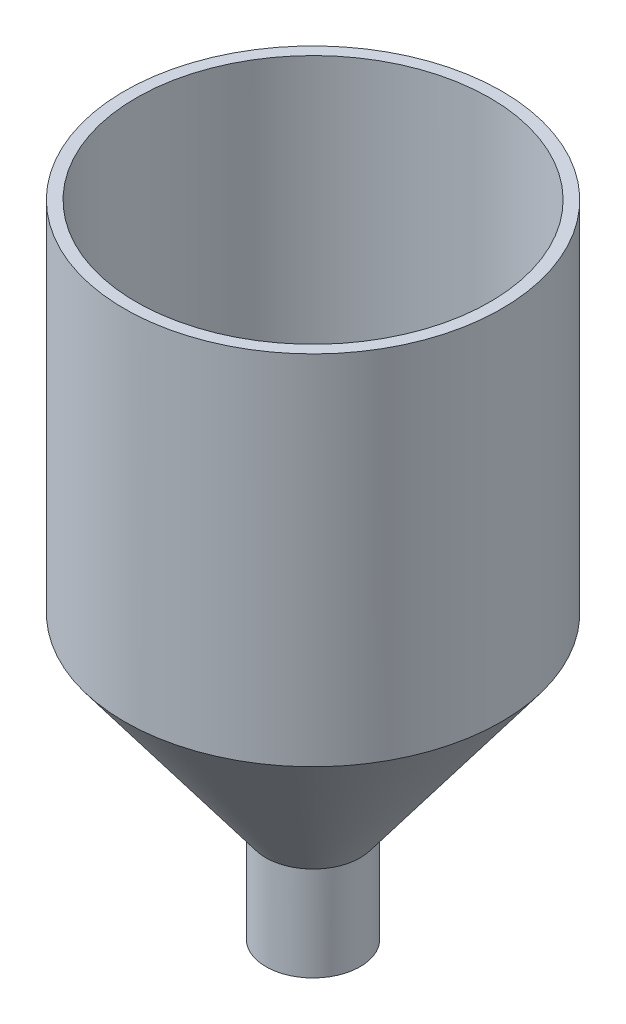
ISO-10303-21;
HEADER;
FILE_DESCRIPTION(('STEP AP214'),'2;1');
FILE_NAME('part.step','',(''),(''),'','','');
FILE_SCHEMA(('AUTOMOTIVE_DESIGN { 1 0 10303 214 1 1 1 1 }'));
ENDSEC;
DATA;
#1=APPLICATION_CONTEXT('core data for automotive mechanical design processes');
#2=APPLICATION_PROTOCOL_DEFINITION('international standard','automotive_design',2000,#1);
#3=PRODUCT_CONTEXT('',#1,'mechanical');
#4=PRODUCT('Part','Part','',(#3));
#5=PRODUCT_RELATED_PRODUCT_CATEGORY('part','',(#4));
#6=PRODUCT_DEFINITION_FORMATION('','',#4);
#7=PRODUCT_DEFINITION_CONTEXT('part definition',#1,'design');
#8=PRODUCT_DEFINITION('design','',#6,#7);
#9=PRODUCT_DEFINITION_SHAPE('','',#8);
#10=(LENGTH_UNIT() NAMED_UNIT(*) SI_UNIT(.MILLI.,.METRE.));
#11=(NAMED_UNIT(*) PLANE_ANGLE_UNIT() SI_UNIT($,.RADIAN.));
#12=(NAMED_UNIT(*) SI_UNIT($,.STERADIAN.) SOLID_ANGLE_UNIT());
#13=UNCERTAINTY_MEASURE_WITH_UNIT(LENGTH_MEASURE(1.E-05),#10,'distance_accuracy_value','');
#14=(GEOMETRIC_REPRESENTATION_CONTEXT(3) GLOBAL_UNCERTAINTY_ASSIGNED_CONTEXT((#13)) GLOBAL_UNIT_ASSIGNED_CONTEXT((#10,
#11,#12)) REPRESENTATION_CONTEXT('',''));
#15=CARTESIAN_POINT('',(0.,0.,0.));
#16=DIRECTION('',(0.,0.,1.));
#17=DIRECTION('',(1.,0.,0.));
#18=AXIS2_PLACEMENT_3D('',#15,#16,#17);
#19=CARTESIAN_POINT('',(-4.,0.,0.));
#20=DIRECTION('',(0.,1.,0.));
#21=DIRECTION('',(0.,0.,1.));
#22=AXIS2_PLACEMENT_3D('',#19,#20,#21);
#23=PLANE('',#22);
#24=CARTESIAN_POINT('',(0.,0.,0.));
#25=DIRECTION('',(0.,-1.,0.));
#26=DIRECTION('',(0.,0.,-1.));
#27=AXIS2_PLACEMENT_3D('',#24,#25,#26);
#28=CIRCLE('',#27,3.);
#29=CARTESIAN_POINT('',(0.,0.,-3.));
#30=VERTEX_POINT('',#29);
#31=EDGE_CURVE('E10',#30,#30,#28,.T.);
#32=ORIENTED_EDGE('',*,*,#31,.F.);
#33=EDGE_LOOP('',(#32));
#34=FACE_BOUND('',#33,.T.);
#35=CARTESIAN_POINT('',(0.,0.,0.));
#36=DIRECTION('',(0.,-1.,0.));
#37=DIRECTION('',(0.,0.,-1.));
#38=AXIS2_PLACEMENT_3D('',#35,#36,#37);
#39=CIRCLE('',#38,4.);
#40=CARTESIAN_POINT('',(0.,0.,-4.));
#41=VERTEX_POINT('',#40);
#42=EDGE_CURVE('E72',#41,#41,#39,.T.);
#43=ORIENTED_EDGE('',*,*,#42,.T.);
#44=EDGE_LOOP('',(#43));
#45=FACE_BOUND('',#44,.T.);
#46=ADVANCED_FACE('F37',(#34,#45),#23,.F.);
#47=CARTESIAN_POINT('',(0.,0.,0.));
#48=DIRECTION('',(0.,-1.,0.));
#49=DIRECTION('',(0.,0.,-1.));
#50=AXIS2_PLACEMENT_3D('',#47,#48,#49);
#51=CYLINDRICAL_SURFACE('',#50,3.);
#52=CARTESIAN_POINT('',(0.,8.33333333333334,0.));
#53=DIRECTION('',(0.,-1.,0.));
#54=DIRECTION('',(0.,0.,-1.));
#55=AXIS2_PLACEMENT_3D('',#52,#53,#54);
#56=CIRCLE('',#55,3.);
#57=CARTESIAN_POINT('',(0.,8.33333333333334,3.));
#58=VERTEX_POINT('',#57);
#59=EDGE_CURVE('E44',#58,#58,#56,.T.);
#60=ORIENTED_EDGE('',*,*,#59,.F.);
#61=EDGE_LOOP('',(#60));
#62=FACE_BOUND('',#61,.T.);
#63=ORIENTED_EDGE('',*,*,#31,.T.);
#64=EDGE_LOOP('',(#63));
#65=FACE_BOUND('',#64,.T.);
#66=ADVANCED_FACE('F110',(#62,#65),#51,.F.);
#67=CARTESIAN_POINT('',(0.,8.33333333333334,0.));
#68=DIRECTION('',(0.,1.,0.));
#69=DIRECTION('',(0.,0.,1.));
#70=AXIS2_PLACEMENT_3D('',#67,#68,#69);
#71=CONICAL_SURFACE('',#70,3.,0.643501108793284);
#72=CARTESIAN_POINT('',(0.,24.3333333333333,0.));
#73=DIRECTION('',(0.,-1.,0.));
#74=DIRECTION('',(0.,0.,-1.));
#75=AXIS2_PLACEMENT_3D('',#72,#73,#74);
#76=CIRCLE('',#75,15.);
#77=CARTESIAN_POINT('',(0.,24.3333333333333,15.));
#78=VERTEX_POINT('',#77);
#79=EDGE_CURVE('E49',#78,#78,#76,.T.);
#80=CARTESIAN_POINT('',(0.,24.3333333333333,15.));
#81=CARTESIAN_POINT('',(0.,24.1666666666667,14.875));
#82=CARTESIAN_POINT('',(0.,24.,14.75));
#83=CARTESIAN_POINT('',(0.,23.6666666666667,14.5));
#84=CARTESIAN_POINT('',(0.,23.5,14.375));
#85=CARTESIAN_POINT('',(0.,23.1666666666667,14.125));
#86=CARTESIAN_POINT('',(0.,23.,14.));
#87=CARTESIAN_POINT('',(0.,22.6666666666667,13.75));
#88=CARTESIAN_POINT('',(0.,22.5,13.625));
#89=CARTESIAN_POINT('',(0.,22.1666666666667,13.375));
#90=CARTESIAN_POINT('',(0.,22.,13.25));
#91=CARTESIAN_POINT('',(0.,21.6666666666667,13.));
#92=CARTESIAN_POINT('',(0.,21.5,12.875));
#93=CARTESIAN_POINT('',(0.,21.1666666666667,12.625));
#94=CARTESIAN_POINT('',(0.,21.,12.5));
#95=CARTESIAN_POINT('',(0.,20.6666666666667,12.25));
#96=CARTESIAN_POINT('',(0.,20.5,12.125));
#97=CARTESIAN_POINT('',(0.,20.1666666666667,11.875));
#98=CARTESIAN_POINT('',(0.,20.,11.75));
#99=CARTESIAN_POINT('',(0.,19.6666666666667,11.5));
#100=CARTESIAN_POINT('',(0.,19.5,11.375));
#101=CARTESIAN_POINT('',(0.,19.1666666666667,11.125));
#102=CARTESIAN_POINT('',(0.,19.,11.));
#103=CARTESIAN_POINT('',(0.,18.6666666666667,10.75));
#104=CARTESIAN_POINT('',(0.,18.5,10.625));
#105=CARTESIAN_POINT('',(0.,18.1666666666667,10.375));
#106=CARTESIAN_POINT('',(0.,18.,10.25));
#107=CARTESIAN_POINT('',(0.,17.6666666666667,10.));
#108=CARTESIAN_POINT('',(0.,17.5,9.87500000000001));
#109=CARTESIAN_POINT('',(0.,17.1666666666667,9.62500000000001));
#110=CARTESIAN_POINT('',(0.,17.,9.50000000000001));
#111=CARTESIAN_POINT('',(0.,16.6666666666667,9.25000000000001));
#112=CARTESIAN_POINT('',(0.,16.5,9.12500000000001));
#113=CARTESIAN_POINT('',(0.,16.1666666666667,8.875));
#114=CARTESIAN_POINT('',(0.,16.,8.75));
#115=CARTESIAN_POINT('',(0.,15.6666666666667,8.5));
#116=CARTESIAN_POINT('',(0.,15.5,8.375));
#117=CARTESIAN_POINT('',(0.,15.1666666666667,8.125));
#118=CARTESIAN_POINT('',(0.,15.,8.));
#119=CARTESIAN_POINT('',(0.,14.6666666666667,7.75));
#120=CARTESIAN_POINT('',(0.,14.5,7.625));
#121=CARTESIAN_POINT('',(0.,14.1666666666667,7.375));
#122=CARTESIAN_POINT('',(0.,14.,7.25));
#123=CARTESIAN_POINT('',(0.,13.6666666666667,7.));
#124=CARTESIAN_POINT('',(0.,13.5,6.875));
#125=CARTESIAN_POINT('',(0.,13.1666666666667,6.625));
#126=CARTESIAN_POINT('',(0.,13.,6.5));
#127=CARTESIAN_POINT('',(0.,12.6666666666667,6.25));
#128=CARTESIAN_POINT('',(0.,12.5,6.125));
#129=CARTESIAN_POINT('',(0.,12.1666666666667,5.875));
#130=CARTESIAN_POINT('',(0.,12.,5.75));
#131=CARTESIAN_POINT('',(0.,11.6666666666667,5.5));
#132=CARTESIAN_POINT('',(0.,11.5,5.375));
#133=CARTESIAN_POINT('',(0.,11.1666666666667,5.125));
#134=CARTESIAN_POINT('',(0.,11.,5.));
#135=CARTESIAN_POINT('',(0.,10.6666666666667,4.75));
#136=CARTESIAN_POINT('',(0.,10.5,4.625));
#137=CARTESIAN_POINT('',(0.,10.1666666666667,4.375));
#138=CARTESIAN_POINT('',(0.,10.,4.25));
#139=CARTESIAN_POINT('',(0.,9.66666666666667,4.));
#140=CARTESIAN_POINT('',(0.,9.5,3.875));
#141=CARTESIAN_POINT('',(0.,9.16666666666667,3.625));
#142=CARTESIAN_POINT('',(0.,9.,3.5));
#143=CARTESIAN_POINT('',(0.,8.66666666666667,3.25));
#144=CARTESIAN_POINT('',(0.,8.5,3.125));
#145=CARTESIAN_POINT('',(0.,8.33333333333334,3.));
#146=B_SPLINE_CURVE_WITH_KNOTS('',3,(#80,#81,#82,#83,#84,#85,#86,#87,#88,#89,#90,#91,#92,#93,
#94,#95,#96,#97,#98,#99,#100,#101,#102,#103,#104,#105,#106,#107,#108,#109,#110,#111,#112,#113,
#114,#115,#116,#117,#118,#119,#120,#121,#122,#123,#124,#125,#126,#127,#128,#129,#130,#131,#132,
#133,#134,#135,#136,#137,#138,#139,#140,#141,#142,#143,#144,#145),.UNSPECIFIED.,.F.,.F.,(4,2,2,
2,2,2,2,2,2,2,2,2,2,2,2,2,2,2,2,2,2,2,2,2,2,2,2,2,2,2,2,2,4),(0.,0.625000000000001,1.25,1.875,
2.5,3.125,3.75,4.375,5.,5.625,6.25,6.875,7.5,8.125,8.75,9.375,10.,10.625,11.25,11.875,12.5,
13.125,13.75,14.375,15.,15.625,16.25,16.875,17.5,18.125,18.75,19.375,20.),.UNSPECIFIED.);
#147=EDGE_CURVE('BSEAM105',#78,#58,#146,.T.);
#148=ORIENTED_EDGE('',*,*,#79,.F.);
#149=ORIENTED_EDGE('',*,*,#59,.T.);
#150=ORIENTED_EDGE('',*,*,#147,.T.);
#151=ORIENTED_EDGE('',*,*,#147,.F.);
#152=EDGE_LOOP('',(#148,#150,#149,#151));
#153=FACE_BOUND('',#152,.T.);
#154=ADVANCED_FACE('F105',(#153),#71,.F.);
#155=CARTESIAN_POINT('',(0.,0.,0.));
#156=DIRECTION('',(0.,-1.,0.));
#157=DIRECTION('',(0.,0.,-1.));
#158=AXIS2_PLACEMENT_3D('',#155,#156,#157);
#159=CYLINDRICAL_SURFACE('',#158,15.);
#160=CARTESIAN_POINT('',(0.,54.3333333333333,0.));
#161=DIRECTION('',(0.,-1.,0.));
#162=DIRECTION('',(0.,0.,-1.));
#163=AXIS2_PLACEMENT_3D('',#160,#161,#162);
#164=CIRCLE('',#163,15.);
#165=CARTESIAN_POINT('',(0.,54.3333333333333,-15.));
#166=VERTEX_POINT('',#165);
#167=EDGE_CURVE('E54',#166,#166,#164,.T.);
#168=ORIENTED_EDGE('',*,*,#167,.F.);
#169=EDGE_LOOP('',(#168));
#170=FACE_BOUND('',#169,.T.);
#171=ORIENTED_EDGE('',*,*,#79,.T.);
#172=EDGE_LOOP('',(#171));
#173=FACE_BOUND('',#172,.T.);
#174=ADVANCED_FACE('F99',(#170,#173),#159,.F.);
#175=CARTESIAN_POINT('',(-15.,54.3333333333333,0.));
#176=DIRECTION('',(0.,-1.,0.));
#177=DIRECTION('',(0.,0.,-1.));
#178=AXIS2_PLACEMENT_3D('',#175,#176,#177);
#179=PLANE('',#178);
#180=CARTESIAN_POINT('',(0.,54.3333333333333,0.));
#181=DIRECTION('',(0.,-1.,0.));
#182=DIRECTION('',(0.,0.,-1.));
#183=AXIS2_PLACEMENT_3D('',#180,#181,#182);
#184=CIRCLE('',#183,16.);
#185=CARTESIAN_POINT('',(0.,54.3333333333333,-16.));
#186=VERTEX_POINT('',#185);
#187=EDGE_CURVE('E60',#186,#186,#184,.T.);
#188=ORIENTED_EDGE('',*,*,#187,.F.);
#189=EDGE_LOOP('',(#188));
#190=FACE_BOUND('',#189,.T.);
#191=ORIENTED_EDGE('',*,*,#167,.T.);
#192=EDGE_LOOP('',(#191));
#193=FACE_BOUND('',#192,.T.);
#194=ADVANCED_FACE('F93',(#190,#193),#179,.F.);
#195=CARTESIAN_POINT('',(0.,0.,0.));
#196=DIRECTION('',(0.,-1.,0.));
#197=DIRECTION('',(0.,0.,-1.));
#198=AXIS2_PLACEMENT_3D('',#195,#196,#197);
#199=CYLINDRICAL_SURFACE('',#198,16.);
#200=CARTESIAN_POINT('',(0.,24.,0.));
#201=DIRECTION('',(0.,-1.,0.));
#202=DIRECTION('',(0.,0.,-1.));
#203=AXIS2_PLACEMENT_3D('',#200,#201,#202);
#204=CIRCLE('',#203,16.);
#205=CARTESIAN_POINT('',(0.,24.,16.));
#206=VERTEX_POINT('',#205);
#207=EDGE_CURVE('E64',#206,#206,#204,.T.);
#208=ORIENTED_EDGE('',*,*,#207,.F.);
#209=EDGE_LOOP('',(#208));
#210=FACE_BOUND('',#209,.T.);
#211=ORIENTED_EDGE('',*,*,#187,.T.);
#212=EDGE_LOOP('',(#211));
#213=FACE_BOUND('',#212,.T.);
#214=ADVANCED_FACE('F87',(#210,#213),#199,.T.);
#215=CARTESIAN_POINT('',(0.,24.,0.));
#216=DIRECTION('',(0.,1.,0.));
#217=DIRECTION('',(0.,0.,1.));
#218=AXIS2_PLACEMENT_3D('',#215,#216,#217);
#219=CONICAL_SURFACE('',#218,16.,0.643501108793284);
#220=CARTESIAN_POINT('',(0.,8.,0.));
#221=DIRECTION('',(0.,-1.,0.));
#222=DIRECTION('',(0.,0.,-1.));
#223=AXIS2_PLACEMENT_3D('',#220,#221,#222);
#224=CIRCLE('',#223,4.);
#225=CARTESIAN_POINT('',(0.,8.,4.));
#226=VERTEX_POINT('',#225);
#227=EDGE_CURVE('E68',#226,#226,#224,.T.);
#228=CARTESIAN_POINT('',(0.,8.,4.));
#229=CARTESIAN_POINT('',(0.,8.16666666666667,4.125));
#230=CARTESIAN_POINT('',(0.,8.33333333333333,4.25));
#231=CARTESIAN_POINT('',(0.,8.66666666666667,4.5));
#232=CARTESIAN_POINT('',(0.,8.83333333333333,4.625));
#233=CARTESIAN_POINT('',(0.,9.16666666666667,4.875));
#234=CARTESIAN_POINT('',(0.,9.33333333333333,5.));
#235=CARTESIAN_POINT('',(0.,9.66666666666667,5.25));
#236=CARTESIAN_POINT('',(0.,9.83333333333333,5.375));
#237=CARTESIAN_POINT('',(0.,10.1666666666667,5.625));
#238=CARTESIAN_POINT('',(0.,10.3333333333333,5.75));
#239=CARTESIAN_POINT('',(0.,10.6666666666667,6.));
#240=CARTESIAN_POINT('',(0.,10.8333333333333,6.125));
#241=CARTESIAN_POINT('',(0.,11.1666666666667,6.375));
#242=CARTESIAN_POINT('',(0.,11.3333333333333,6.5));
#243=CARTESIAN_POINT('',(0.,11.6666666666667,6.75));
#244=CARTESIAN_POINT('',(0.,11.8333333333333,6.875));
#245=CARTESIAN_POINT('',(0.,12.1666666666667,7.125));
#246=CARTESIAN_POINT('',(0.,12.3333333333333,7.25));
#247=CARTESIAN_POINT('',(0.,12.6666666666667,7.5));
#248=CARTESIAN_POINT('',(0.,12.8333333333333,7.625));
#249=CARTESIAN_POINT('',(0.,13.1666666666667,7.875));
#250=CARTESIAN_POINT('',(0.,13.3333333333333,8.));
#251=CARTESIAN_POINT('',(0.,13.6666666666667,8.25));
#252=CARTESIAN_POINT('',(0.,13.8333333333333,8.375));
#253=CARTESIAN_POINT('',(0.,14.1666666666667,8.625));
#254=CARTESIAN_POINT('',(0.,14.3333333333333,8.75));
#255=CARTESIAN_POINT('',(0.,14.6666666666667,9.));
#256=CARTESIAN_POINT('',(0.,14.8333333333333,9.125));
#257=CARTESIAN_POINT('',(0.,15.1666666666667,9.375));
#258=CARTESIAN_POINT('',(0.,15.3333333333333,9.5));
#259=CARTESIAN_POINT('',(0.,15.6666666666667,9.75));
#260=CARTESIAN_POINT('',(0.,15.8333333333333,9.875));
#261=CARTESIAN_POINT('',(0.,16.1666666666667,10.125));
#262=CARTESIAN_POINT('',(0.,16.3333333333333,10.25));
#263=CARTESIAN_POINT('',(0.,16.6666666666667,10.5));
#264=CARTESIAN_POINT('',(0.,16.8333333333333,10.625));
#265=CARTESIAN_POINT('',(0.,17.1666666666667,10.875));
#266=CARTESIAN_POINT('',(0.,17.3333333333333,11.));
#267=CARTESIAN_POINT('',(0.,17.6666666666667,11.25));
#268=CARTESIAN_POINT('',(0.,17.8333333333333,11.375));
#269=CARTESIAN_POINT('',(0.,18.1666666666667,11.625));
#270=CARTESIAN_POINT('',(0.,18.3333333333333,11.75));
#271=CARTESIAN_POINT('',(0.,18.6666666666667,12.));
#272=CARTESIAN_POINT('',(0.,18.8333333333333,12.125));
#273=CARTESIAN_POINT('',(0.,19.1666666666667,12.375));
#274=CARTESIAN_POINT('',(0.,19.3333333333333,12.5));
#275=CARTESIAN_POINT('',(0.,19.6666666666667,12.75));
#276=CARTESIAN_POINT('',(0.,19.8333333333333,12.875));
#277=CARTESIAN_POINT('',(0.,20.1666666666667,13.125));
#278=CARTESIAN_POINT('',(0.,20.3333333333333,13.25));
#279=CARTESIAN_POINT('',(0.,20.6666666666667,13.5));
#280=CARTESIAN_POINT('',(0.,20.8333333333333,13.625));
#281=CARTESIAN_POINT('',(0.,21.1666666666667,13.875));
#282=CARTESIAN_POINT('',(0.,21.3333333333333,14.));
#283=CARTESIAN_POINT('',(0.,21.6666666666667,14.25));
#284=CARTESIAN_POINT('',(0.,21.8333333333333,14.375));
#285=CARTESIAN_POINT('',(0.,22.1666666666667,14.625));
#286=CARTESIAN_POINT('',(0.,22.3333333333333,14.75));
#287=CARTESIAN_POINT('',(0.,22.6666666666667,15.));
#288=CARTESIAN_POINT('',(0.,22.8333333333333,15.125));
#289=CARTESIAN_POINT('',(0.,23.1666666666667,15.375));
#290=CARTESIAN_POINT('',(0.,23.3333333333333,15.5));
#291=CARTESIAN_POINT('',(0.,23.6666666666667,15.75));
#292=CARTESIAN_POINT('',(0.,23.8333333333333,15.875));
#293=CARTESIAN_POINT('',(0.,24.,16.));
#294=B_SPLINE_CURVE_WITH_KNOTS('',3,(#228,#229,#230,#231,#232,#233,#234,#235,#236,#237,#238,
#239,#240,#241,#242,#243,#244,#245,#246,#247,#248,#249,#250,#251,#252,#253,#254,#255,#256,#257,
#258,#259,#260,#261,#262,#263,#264,#265,#266,#267,#268,#269,#270,#271,#272,#273,#274,#275,#276,
#277,#278,#279,#280,#281,#282,#283,#284,#285,#286,#287,#288,#289,#290,#291,#292,#293),
.UNSPECIFIED.,.F.,.F.,(4,2,2,2,2,2,2,2,2,2,2,2,2,2,2,2,2,2,2,2,2,2,2,2,2,2,2,2,2,2,2,2,4),(0.,
0.625000000000001,1.25,1.875,2.5,3.125,3.75,4.375,5.,5.625,6.25,6.875,7.5,8.125,8.75,9.375,10.,
10.625,11.25,11.875,12.5,13.125,13.75,14.375,15.,15.625,16.25,16.875,17.5,18.125,18.75,19.375,
20.),.UNSPECIFIED.);
#295=EDGE_CURVE('BSEAM81',#226,#206,#294,.T.);
#296=ORIENTED_EDGE('',*,*,#227,.F.);
#297=ORIENTED_EDGE('',*,*,#207,.T.);
#298=ORIENTED_EDGE('',*,*,#295,.T.);
#299=ORIENTED_EDGE('',*,*,#295,.F.);
#300=EDGE_LOOP('',(#296,#298,#297,#299));
#301=FACE_BOUND('',#300,.T.);
#302=ADVANCED_FACE('F81',(#301),#219,.T.);
#303=CARTESIAN_POINT('',(0.,0.,0.));
#304=DIRECTION('',(0.,-1.,0.));
#305=DIRECTION('',(0.,0.,-1.));
#306=AXIS2_PLACEMENT_3D('',#303,#304,#305);
#307=CYLINDRICAL_SURFACE('',#306,4.);
#308=ORIENTED_EDGE('',*,*,#42,.F.);
#309=EDGE_LOOP('',(#308));
#310=FACE_BOUND('',#309,.T.);
#311=ORIENTED_EDGE('',*,*,#227,.T.);
#312=EDGE_LOOP('',(#311));
#313=FACE_BOUND('',#312,.T.);
#314=ADVANCED_FACE('F78',(#310,#313),#307,.T.);
#315=CLOSED_SHELL('',(#46,#66,#154,#174,#194,#214,#302,#314));
#316=MANIFOLD_SOLID_BREP('B2',#315);
#317=ADVANCED_BREP_SHAPE_REPRESENTATION('',(#18,#316),#14);
#318=SHAPE_DEFINITION_REPRESENTATION(#9,#317);
ENDSEC;
END-ISO-10303-21;
